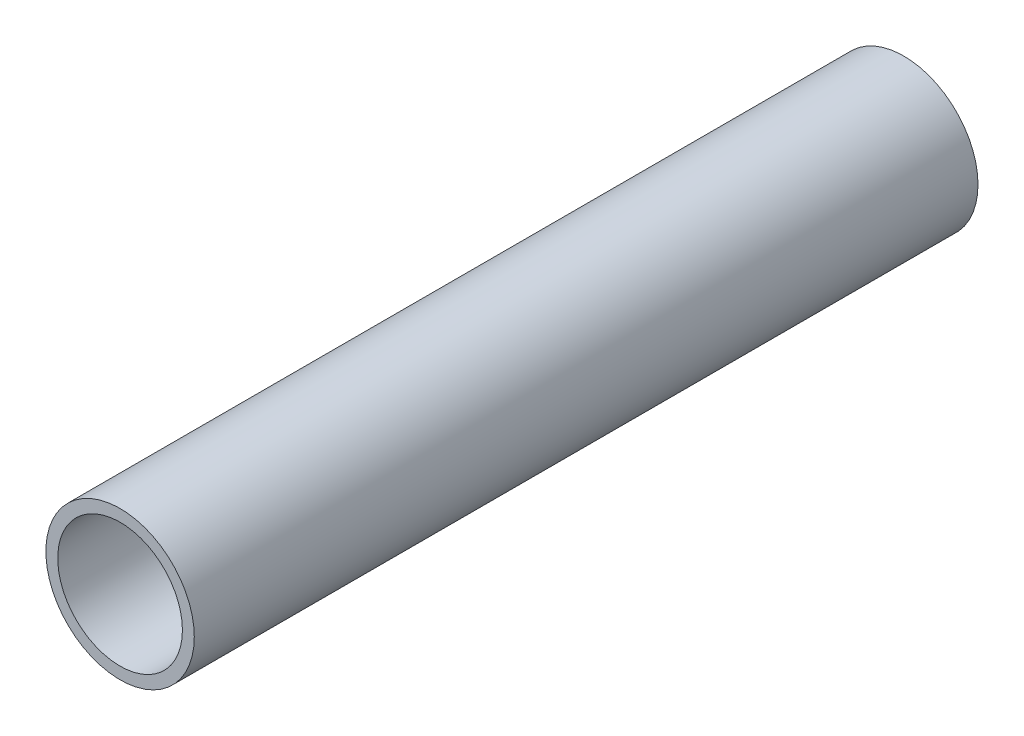
ISO-10303-21;
HEADER;
FILE_DESCRIPTION(('STEP AP214'),'2;1');
FILE_NAME('part.step','',(''),(''),'','','');
FILE_SCHEMA(('AUTOMOTIVE_DESIGN { 1 0 10303 214 1 1 1 1 }'));
ENDSEC;
DATA;
#1=APPLICATION_CONTEXT('core data for automotive mechanical design processes');
#2=APPLICATION_PROTOCOL_DEFINITION('international standard','automotive_design',2000,#1);
#3=PRODUCT_CONTEXT('',#1,'mechanical');
#4=PRODUCT('Part','Part','',(#3));
#5=PRODUCT_RELATED_PRODUCT_CATEGORY('part','',(#4));
#6=PRODUCT_DEFINITION_FORMATION('','',#4);
#7=PRODUCT_DEFINITION_CONTEXT('part definition',#1,'design');
#8=PRODUCT_DEFINITION('design','',#6,#7);
#9=PRODUCT_DEFINITION_SHAPE('','',#8);
#10=(LENGTH_UNIT() NAMED_UNIT(*) SI_UNIT(.MILLI.,.METRE.));
#11=(NAMED_UNIT(*) PLANE_ANGLE_UNIT() SI_UNIT($,.RADIAN.));
#12=(NAMED_UNIT(*) SI_UNIT($,.STERADIAN.) SOLID_ANGLE_UNIT());
#13=UNCERTAINTY_MEASURE_WITH_UNIT(LENGTH_MEASURE(1.E-05),#10,'distance_accuracy_value','');
#14=(GEOMETRIC_REPRESENTATION_CONTEXT(3) GLOBAL_UNCERTAINTY_ASSIGNED_CONTEXT((#13)) GLOBAL_UNIT_ASSIGNED_CONTEXT((#10,
#11,#12)) REPRESENTATION_CONTEXT('',''));
#15=CARTESIAN_POINT('',(0.,0.,0.));
#16=DIRECTION('',(0.,0.,1.));
#17=DIRECTION('',(1.,0.,0.));
#18=AXIS2_PLACEMENT_3D('',#15,#16,#17);
#19=CARTESIAN_POINT('',(0.,0.,132.));
#20=DIRECTION('',(0.,0.,1.));
#21=DIRECTION('',(1.,0.,0.));
#22=AXIS2_PLACEMENT_3D('',#19,#20,#21);
#23=PLANE('',#22);
#24=CARTESIAN_POINT('',(0.,0.,132.));
#25=DIRECTION('',(0.,0.,1.));
#26=DIRECTION('',(1.,0.,0.));
#27=AXIS2_PLACEMENT_3D('',#24,#25,#26);
#28=CIRCLE('',#27,12.5);
#29=CARTESIAN_POINT('',(12.5,0.,132.));
#30=VERTEX_POINT('',#29);
#31=EDGE_CURVE('E10',#30,#30,#28,.T.);
#32=ORIENTED_EDGE('',*,*,#31,.T.);
#33=EDGE_LOOP('',(#32));
#34=FACE_BOUND('',#33,.T.);
#35=CARTESIAN_POINT('',(0.,0.,132.));
#36=DIRECTION('',(0.,0.,1.));
#37=DIRECTION('',(1.,0.,0.));
#38=AXIS2_PLACEMENT_3D('',#35,#36,#37);
#39=CIRCLE('',#38,10.5);
#40=CARTESIAN_POINT('',(10.5,0.,132.));
#41=VERTEX_POINT('',#40);
#42=EDGE_CURVE('E42',#41,#41,#39,.T.);
#43=ORIENTED_EDGE('',*,*,#42,.F.);
#44=EDGE_LOOP('',(#43));
#45=FACE_BOUND('',#44,.T.);
#46=ADVANCED_FACE('F31',(#34,#45),#23,.T.);
#47=CARTESIAN_POINT('',(0.,0.,0.));
#48=DIRECTION('',(0.,0.,1.));
#49=DIRECTION('',(1.,0.,0.));
#50=AXIS2_PLACEMENT_3D('',#47,#48,#49);
#51=PLANE('',#50);
#52=CARTESIAN_POINT('',(0.,0.,0.));
#53=DIRECTION('',(0.,0.,1.));
#54=DIRECTION('',(1.,0.,0.));
#55=AXIS2_PLACEMENT_3D('',#52,#53,#54);
#56=CIRCLE('',#55,12.5);
#57=CARTESIAN_POINT('',(12.5,0.,0.));
#58=VERTEX_POINT('',#57);
#59=EDGE_CURVE('E35',#58,#58,#56,.T.);
#60=ORIENTED_EDGE('',*,*,#59,.F.);
#61=EDGE_LOOP('',(#60));
#62=FACE_BOUND('',#61,.T.);
#63=CARTESIAN_POINT('',(0.,0.,0.));
#64=DIRECTION('',(0.,0.,1.));
#65=DIRECTION('',(1.,0.,0.));
#66=AXIS2_PLACEMENT_3D('',#63,#64,#65);
#67=CIRCLE('',#66,10.5);
#68=CARTESIAN_POINT('',(10.5,0.,0.));
#69=VERTEX_POINT('',#68);
#70=EDGE_CURVE('E44',#69,#69,#67,.T.);
#71=ORIENTED_EDGE('',*,*,#70,.T.);
#72=EDGE_LOOP('',(#71));
#73=FACE_BOUND('',#72,.T.);
#74=ADVANCED_FACE('F54',(#62,#73),#51,.F.);
#75=CARTESIAN_POINT('',(0.,0.,132.));
#76=DIRECTION('',(0.,0.,-1.));
#77=DIRECTION('',(-1.,0.,0.));
#78=AXIS2_PLACEMENT_3D('',#75,#76,#77);
#79=CYLINDRICAL_SURFACE('',#78,12.5);
#80=ORIENTED_EDGE('',*,*,#31,.F.);
#81=EDGE_LOOP('',(#80));
#82=FACE_BOUND('',#81,.T.);
#83=ORIENTED_EDGE('',*,*,#59,.T.);
#84=EDGE_LOOP('',(#83));
#85=FACE_BOUND('',#84,.T.);
#86=ADVANCED_FACE('F33',(#82,#85),#79,.T.);
#87=CARTESIAN_POINT('',(0.,0.,132.));
#88=DIRECTION('',(0.,0.,-1.));
#89=DIRECTION('',(-1.,0.,0.));
#90=AXIS2_PLACEMENT_3D('',#87,#88,#89);
#91=CYLINDRICAL_SURFACE('',#90,10.5);
#92=ORIENTED_EDGE('',*,*,#42,.T.);
#93=EDGE_LOOP('',(#92));
#94=FACE_BOUND('',#93,.T.);
#95=ORIENTED_EDGE('',*,*,#70,.F.);
#96=EDGE_LOOP('',(#95));
#97=FACE_BOUND('',#96,.T.);
#98=ADVANCED_FACE('F50',(#94,#97),#91,.F.);
#99=CLOSED_SHELL('',(#46,#74,#86,#98));
#100=MANIFOLD_SOLID_BREP('B2',#99);
#101=ADVANCED_BREP_SHAPE_REPRESENTATION('',(#18,#100),#14);
#102=SHAPE_DEFINITION_REPRESENTATION(#9,#101);
ENDSEC;
END-ISO-10303-21;
